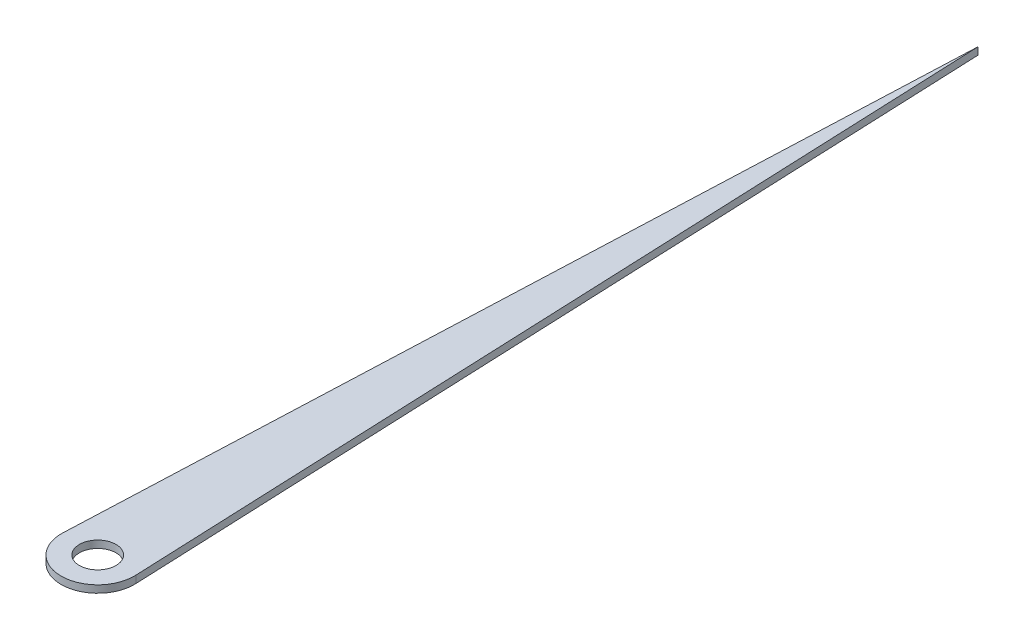
ISO-10303-21;
HEADER;
FILE_DESCRIPTION(('STEP AP214'),'2;1');
FILE_NAME('part.step','',(''),(''),'','','');
FILE_SCHEMA(('AUTOMOTIVE_DESIGN { 1 0 10303 214 1 1 1 1 }'));
ENDSEC;
DATA;
#1=APPLICATION_CONTEXT('core data for automotive mechanical design processes');
#2=APPLICATION_PROTOCOL_DEFINITION('international standard','automotive_design',2000,#1);
#3=PRODUCT_CONTEXT('',#1,'mechanical');
#4=PRODUCT('Part','Part','',(#3));
#5=PRODUCT_RELATED_PRODUCT_CATEGORY('part','',(#4));
#6=PRODUCT_DEFINITION_FORMATION('','',#4);
#7=PRODUCT_DEFINITION_CONTEXT('part definition',#1,'design');
#8=PRODUCT_DEFINITION('design','',#6,#7);
#9=PRODUCT_DEFINITION_SHAPE('','',#8);
#10=(LENGTH_UNIT() NAMED_UNIT(*) SI_UNIT(.MILLI.,.METRE.));
#11=(NAMED_UNIT(*) PLANE_ANGLE_UNIT() SI_UNIT($,.RADIAN.));
#12=(NAMED_UNIT(*) SI_UNIT($,.STERADIAN.) SOLID_ANGLE_UNIT());
#13=UNCERTAINTY_MEASURE_WITH_UNIT(LENGTH_MEASURE(1.E-05),#10,'distance_accuracy_value','');
#14=(GEOMETRIC_REPRESENTATION_CONTEXT(3) GLOBAL_UNCERTAINTY_ASSIGNED_CONTEXT((#13)) GLOBAL_UNIT_ASSIGNED_CONTEXT((#10,
#11,#12)) REPRESENTATION_CONTEXT('',''));
#15=CARTESIAN_POINT('',(0.,0.,0.));
#16=DIRECTION('',(0.,0.,1.));
#17=DIRECTION('',(1.,0.,0.));
#18=AXIS2_PLACEMENT_3D('',#15,#16,#17);
#19=CARTESIAN_POINT('',(0.0959661676135408,0.254,0.00399288073264556));
#20=DIRECTION('',(0.999135543886472,0.,0.0415712032864667));
#21=DIRECTION('',(0.0415712032864667,0.,-0.999135543886472));
#22=AXIS2_PLACEMENT_3D('',#19,#20,#21);
#23=PLANE('',#22);
#24=DIRECTION('',(-0.0415712032864667,0.,0.999135543886472));
#25=VECTOR('',#24,1.);
#26=CARTESIAN_POINT('',(0.0959661676135408,0.,0.00399288073264556));
#27=LINE('',#26,#25);
#28=CARTESIAN_POINT('',(1.37178273182201,0.,-30.6593888837008));
#29=VERTEX_POINT('',#28);
#30=CARTESIAN_POINT('',(0.102880591086192,0.,-0.162190575863561));
#31=VERTEX_POINT('',#30);
#32=EDGE_CURVE('E83',#29,#31,#27,.T.);
#33=ORIENTED_EDGE('',*,*,#32,.T.);
#34=DIRECTION('',(0.,-1.,0.));
#35=VECTOR('',#34,1.);
#36=CARTESIAN_POINT('',(0.102880591086192,0.254,-0.162190575863561));
#37=LINE('',#36,#35);
#38=CARTESIAN_POINT('',(0.102880591086192,0.254,-0.162190575863561));
#39=VERTEX_POINT('',#38);
#40=EDGE_CURVE('E11',#39,#31,#37,.T.);
#41=ORIENTED_EDGE('',*,*,#40,.F.);
#42=DIRECTION('',(-0.0415712032864667,0.,0.999135543886472));
#43=VECTOR('',#42,1.);
#44=CARTESIAN_POINT('',(0.0959661676135408,0.254,0.00399288073264556));
#45=LINE('',#44,#43);
#46=CARTESIAN_POINT('',(1.37178273182201,0.254,-30.6593888837008));
#47=VERTEX_POINT('',#46);
#48=EDGE_CURVE('E74',#47,#39,#45,.T.);
#49=ORIENTED_EDGE('',*,*,#48,.F.);
#50=DIRECTION('',(0.,-1.,0.));
#51=VECTOR('',#50,1.);
#52=CARTESIAN_POINT('',(1.37178273182201,0.254,-30.6593888837008));
#53=LINE('',#52,#51);
#54=EDGE_CURVE('E84',#47,#29,#53,.T.);
#55=ORIENTED_EDGE('',*,*,#54,.T.);
#56=EDGE_LOOP('',(#33,#41,#49,#55));
#57=FACE_BOUND('',#56,.T.);
#58=ADVANCED_FACE('F34',(#57),#23,.F.);
#59=CARTESIAN_POINT('',(1.37178273182201,0.254,-0.109395147689748));
#60=DIRECTION('',(0.,-1.,0.));
#61=DIRECTION('',(0.,0.,-1.));
#62=AXIS2_PLACEMENT_3D('',#59,#60,#61);
#63=CYLINDRICAL_SURFACE('',#62,1.27);
#64=CARTESIAN_POINT('',(1.37178273182201,0.,-0.109395147689748));
#65=DIRECTION('',(0.,1.,0.));
#66=DIRECTION('',(0.,0.,1.));
#67=AXIS2_PLACEMENT_3D('',#64,#65,#66);
#68=CIRCLE('',#67,1.27);
#69=CARTESIAN_POINT('',(2.64068487255783,0.,-0.162190575863561));
#70=VERTEX_POINT('',#69);
#71=EDGE_CURVE('E62',#31,#70,#68,.T.);
#72=ORIENTED_EDGE('',*,*,#71,.T.);
#73=DIRECTION('',(0.,-1.,0.));
#74=VECTOR('',#73,1.);
#75=CARTESIAN_POINT('',(2.64068487255783,0.254,-0.162190575863561));
#76=LINE('',#75,#74);
#77=CARTESIAN_POINT('',(2.64068487255783,0.254,-0.162190575863561));
#78=VERTEX_POINT('',#77);
#79=EDGE_CURVE('E42',#78,#70,#76,.T.);
#80=ORIENTED_EDGE('',*,*,#79,.F.);
#81=CARTESIAN_POINT('',(1.37178273182201,0.254,-0.109395147689748));
#82=DIRECTION('',(0.,1.,0.));
#83=DIRECTION('',(0.,0.,1.));
#84=AXIS2_PLACEMENT_3D('',#81,#82,#83);
#85=CIRCLE('',#84,1.27);
#86=EDGE_CURVE('E70',#39,#78,#85,.T.);
#87=ORIENTED_EDGE('',*,*,#86,.F.);
#88=ORIENTED_EDGE('',*,*,#40,.T.);
#89=EDGE_LOOP('',(#72,#80,#87,#88));
#90=FACE_BOUND('',#89,.T.);
#91=ADVANCED_FACE('F71',(#90),#63,.T.);
#92=CARTESIAN_POINT('',(2.64285796237825,0.254,-0.109961842798545));
#93=DIRECTION('',(-0.999135543886472,0.,0.0415712032864667));
#94=DIRECTION('',(0.0415712032864667,0.,0.999135543886472));
#95=AXIS2_PLACEMENT_3D('',#92,#93,#94);
#96=PLANE('',#95);
#97=DIRECTION('',(-0.0415712032864667,0.,-0.999135543886472));
#98=VECTOR('',#97,1.);
#99=CARTESIAN_POINT('',(2.64285796237825,0.,-0.109961842798545));
#100=LINE('',#99,#98);
#101=EDGE_CURVE('E67',#70,#29,#100,.T.);
#102=ORIENTED_EDGE('',*,*,#101,.T.);
#103=ORIENTED_EDGE('',*,*,#54,.F.);
#104=DIRECTION('',(-0.0415712032864667,0.,-0.999135543886472));
#105=VECTOR('',#104,1.);
#106=CARTESIAN_POINT('',(2.64285796237825,0.254,-0.109961842798545));
#107=LINE('',#106,#105);
#108=EDGE_CURVE('E50',#78,#47,#107,.T.);
#109=ORIENTED_EDGE('',*,*,#108,.F.);
#110=ORIENTED_EDGE('',*,*,#79,.T.);
#111=EDGE_LOOP('',(#102,#103,#109,#110));
#112=FACE_BOUND('',#111,.T.);
#113=ADVANCED_FACE('F95',(#112),#96,.F.);
#114=CARTESIAN_POINT('',(1.37178273182201,0.254,-0.109395147689748));
#115=DIRECTION('',(0.,-1.,0.));
#116=DIRECTION('',(0.,0.,-1.));
#117=AXIS2_PLACEMENT_3D('',#114,#115,#116);
#118=CYLINDRICAL_SURFACE('',#117,0.635);
#119=CARTESIAN_POINT('',(1.37178273182201,0.254,-0.109395147689748));
#120=DIRECTION('',(0.,1.,0.));
#121=DIRECTION('',(0.,0.,1.));
#122=AXIS2_PLACEMENT_3D('',#119,#120,#121);
#123=CIRCLE('',#122,0.635);
#124=CARTESIAN_POINT('',(1.37178273182201,0.254,0.525604852310252));
#125=VERTEX_POINT('',#124);
#126=EDGE_CURVE('E89',#125,#125,#123,.T.);
#127=ORIENTED_EDGE('',*,*,#126,.T.);
#128=EDGE_LOOP('',(#127));
#129=FACE_BOUND('',#128,.T.);
#130=CARTESIAN_POINT('',(1.37178273182201,0.,-0.109395147689748));
#131=DIRECTION('',(0.,1.,0.));
#132=DIRECTION('',(0.,0.,1.));
#133=AXIS2_PLACEMENT_3D('',#130,#131,#132);
#134=CIRCLE('',#133,0.635);
#135=CARTESIAN_POINT('',(1.37178273182201,0.,0.525604852310252));
#136=VERTEX_POINT('',#135);
#137=EDGE_CURVE('E80',#136,#136,#134,.T.);
#138=ORIENTED_EDGE('',*,*,#137,.F.);
#139=EDGE_LOOP('',(#138));
#140=FACE_BOUND('',#139,.T.);
#141=ADVANCED_FACE('F102',(#129,#140),#118,.F.);
#142=CARTESIAN_POINT('',(0.,0.254,0.));
#143=DIRECTION('',(0.,1.,0.));
#144=DIRECTION('',(0.,0.,1.));
#145=AXIS2_PLACEMENT_3D('',#142,#143,#144);
#146=PLANE('',#145);
#147=ORIENTED_EDGE('',*,*,#48,.T.);
#148=ORIENTED_EDGE('',*,*,#86,.T.);
#149=ORIENTED_EDGE('',*,*,#108,.T.);
#150=EDGE_LOOP('',(#147,#148,#149));
#151=FACE_BOUND('',#150,.T.);
#152=ORIENTED_EDGE('',*,*,#126,.F.);
#153=EDGE_LOOP('',(#152));
#154=FACE_BOUND('',#153,.T.);
#155=ADVANCED_FACE('F77',(#151,#154),#146,.T.);
#156=CARTESIAN_POINT('',(0.,0.,0.));
#157=DIRECTION('',(0.,1.,0.));
#158=DIRECTION('',(0.,0.,1.));
#159=AXIS2_PLACEMENT_3D('',#156,#157,#158);
#160=PLANE('',#159);
#161=ORIENTED_EDGE('',*,*,#32,.F.);
#162=ORIENTED_EDGE('',*,*,#101,.F.);
#163=ORIENTED_EDGE('',*,*,#71,.F.);
#164=EDGE_LOOP('',(#161,#162,#163));
#165=FACE_BOUND('',#164,.T.);
#166=ORIENTED_EDGE('',*,*,#137,.T.);
#167=EDGE_LOOP('',(#166));
#168=FACE_BOUND('',#167,.T.);
#169=ADVANCED_FACE('F96',(#165,#168),#160,.F.);
#170=CLOSED_SHELL('',(#58,#91,#113,#141,#155,#169));
#171=MANIFOLD_SOLID_BREP('B2',#170);
#172=ADVANCED_BREP_SHAPE_REPRESENTATION('',(#18,#171),#14);
#173=SHAPE_DEFINITION_REPRESENTATION(#9,#172);
ENDSEC;
END-ISO-10303-21;
